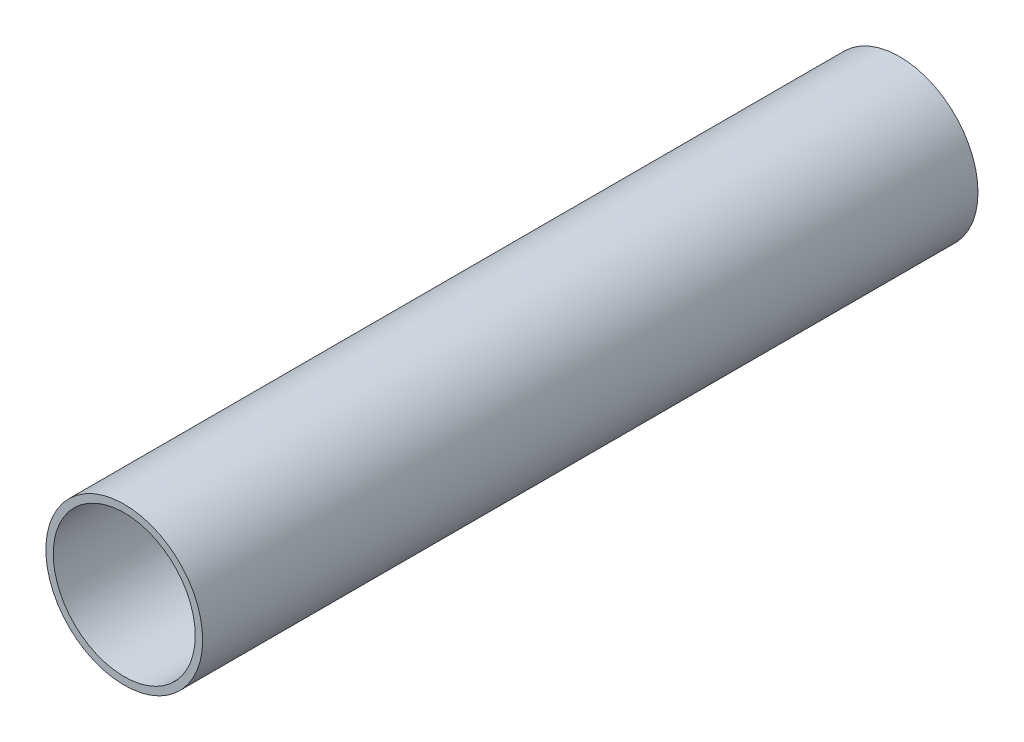
ISO-10303-21;
HEADER;
FILE_DESCRIPTION(('STEP AP214'),'2;1');
FILE_NAME('part.step','',(''),(''),'','','');
FILE_SCHEMA(('AUTOMOTIVE_DESIGN { 1 0 10303 214 1 1 1 1 }'));
ENDSEC;
DATA;
#1=APPLICATION_CONTEXT('core data for automotive mechanical design processes');
#2=APPLICATION_PROTOCOL_DEFINITION('international standard','automotive_design',2000,#1);
#3=PRODUCT_CONTEXT('',#1,'mechanical');
#4=PRODUCT('Part','Part','',(#3));
#5=PRODUCT_RELATED_PRODUCT_CATEGORY('part','',(#4));
#6=PRODUCT_DEFINITION_FORMATION('','',#4);
#7=PRODUCT_DEFINITION_CONTEXT('part definition',#1,'design');
#8=PRODUCT_DEFINITION('design','',#6,#7);
#9=PRODUCT_DEFINITION_SHAPE('','',#8);
#10=(LENGTH_UNIT() NAMED_UNIT(*) SI_UNIT(.MILLI.,.METRE.));
#11=(NAMED_UNIT(*) PLANE_ANGLE_UNIT() SI_UNIT($,.RADIAN.));
#12=(NAMED_UNIT(*) SI_UNIT($,.STERADIAN.) SOLID_ANGLE_UNIT());
#13=UNCERTAINTY_MEASURE_WITH_UNIT(LENGTH_MEASURE(1.E-05),#10,'distance_accuracy_value','');
#14=(GEOMETRIC_REPRESENTATION_CONTEXT(3) GLOBAL_UNCERTAINTY_ASSIGNED_CONTEXT((#13)) GLOBAL_UNIT_ASSIGNED_CONTEXT((#10,
#11,#12)) REPRESENTATION_CONTEXT('',''));
#15=CARTESIAN_POINT('',(0.,0.,0.));
#16=DIRECTION('',(0.,0.,1.));
#17=DIRECTION('',(1.,0.,0.));
#18=AXIS2_PLACEMENT_3D('',#15,#16,#17);
#19=CARTESIAN_POINT('',(0.,0.,157.));
#20=DIRECTION('',(0.,0.,1.));
#21=DIRECTION('',(1.,0.,0.));
#22=AXIS2_PLACEMENT_3D('',#19,#20,#21);
#23=PLANE('',#22);
#24=CARTESIAN_POINT('',(0.,0.,157.));
#25=DIRECTION('',(0.,0.,1.));
#26=DIRECTION('',(1.,0.,0.));
#27=AXIS2_PLACEMENT_3D('',#24,#25,#26);
#28=CIRCLE('',#27,31.75);
#29=CARTESIAN_POINT('',(31.75,0.,157.));
#30=VERTEX_POINT('',#29);
#31=EDGE_CURVE('E10',#30,#30,#28,.T.);
#32=ORIENTED_EDGE('',*,*,#31,.T.);
#33=EDGE_LOOP('',(#32));
#34=FACE_BOUND('',#33,.T.);
#35=CARTESIAN_POINT('',(0.,0.,157.));
#36=DIRECTION('',(0.,0.,1.));
#37=DIRECTION('',(1.,0.,0.));
#38=AXIS2_PLACEMENT_3D('',#35,#36,#37);
#39=CIRCLE('',#38,28.75);
#40=CARTESIAN_POINT('',(28.75,0.,157.));
#41=VERTEX_POINT('',#40);
#42=EDGE_CURVE('E52',#41,#41,#39,.T.);
#43=ORIENTED_EDGE('',*,*,#42,.F.);
#44=EDGE_LOOP('',(#43));
#45=FACE_BOUND('',#44,.T.);
#46=ADVANCED_FACE('F41',(#34,#45),#23,.T.);
#47=CARTESIAN_POINT('',(0.,0.,-157.));
#48=DIRECTION('',(0.,0.,1.));
#49=DIRECTION('',(1.,0.,0.));
#50=AXIS2_PLACEMENT_3D('',#47,#48,#49);
#51=PLANE('',#50);
#52=CARTESIAN_POINT('',(0.,0.,-157.));
#53=DIRECTION('',(0.,0.,1.));
#54=DIRECTION('',(1.,0.,0.));
#55=AXIS2_PLACEMENT_3D('',#52,#53,#54);
#56=CIRCLE('',#55,31.75);
#57=CARTESIAN_POINT('',(31.75,0.,-157.));
#58=VERTEX_POINT('',#57);
#59=EDGE_CURVE('E45',#58,#58,#56,.T.);
#60=ORIENTED_EDGE('',*,*,#59,.F.);
#61=EDGE_LOOP('',(#60));
#62=FACE_BOUND('',#61,.T.);
#63=CARTESIAN_POINT('',(0.,0.,-157.));
#64=DIRECTION('',(0.,0.,1.));
#65=DIRECTION('',(1.,0.,0.));
#66=AXIS2_PLACEMENT_3D('',#63,#64,#65);
#67=CIRCLE('',#66,28.75);
#68=CARTESIAN_POINT('',(28.75,0.,-157.));
#69=VERTEX_POINT('',#68);
#70=EDGE_CURVE('E54',#69,#69,#67,.T.);
#71=ORIENTED_EDGE('',*,*,#70,.T.);
#72=EDGE_LOOP('',(#71));
#73=FACE_BOUND('',#72,.T.);
#74=ADVANCED_FACE('F64',(#62,#73),#51,.F.);
#75=CARTESIAN_POINT('',(0.,0.,157.));
#76=DIRECTION('',(0.,0.,-1.));
#77=DIRECTION('',(-1.,0.,0.));
#78=AXIS2_PLACEMENT_3D('',#75,#76,#77);
#79=CYLINDRICAL_SURFACE('',#78,31.75);
#80=ORIENTED_EDGE('',*,*,#31,.F.);
#81=EDGE_LOOP('',(#80));
#82=FACE_BOUND('',#81,.T.);
#83=ORIENTED_EDGE('',*,*,#59,.T.);
#84=EDGE_LOOP('',(#83));
#85=FACE_BOUND('',#84,.T.);
#86=ADVANCED_FACE('F43',(#82,#85),#79,.T.);
#87=CARTESIAN_POINT('',(0.,0.,157.));
#88=DIRECTION('',(0.,0.,-1.));
#89=DIRECTION('',(-1.,0.,0.));
#90=AXIS2_PLACEMENT_3D('',#87,#88,#89);
#91=CYLINDRICAL_SURFACE('',#90,28.75);
#92=ORIENTED_EDGE('',*,*,#42,.T.);
#93=EDGE_LOOP('',(#92));
#94=FACE_BOUND('',#93,.T.);
#95=ORIENTED_EDGE('',*,*,#70,.F.);
#96=EDGE_LOOP('',(#95));
#97=FACE_BOUND('',#96,.T.);
#98=ADVANCED_FACE('F60',(#94,#97),#91,.F.);
#99=CLOSED_SHELL('',(#46,#74,#86,#98));
#100=MANIFOLD_SOLID_BREP('B2',#99);
#101=ADVANCED_BREP_SHAPE_REPRESENTATION('',(#18,#100),#14);
#102=SHAPE_DEFINITION_REPRESENTATION(#9,#101);
ENDSEC;
END-ISO-10303-21;
